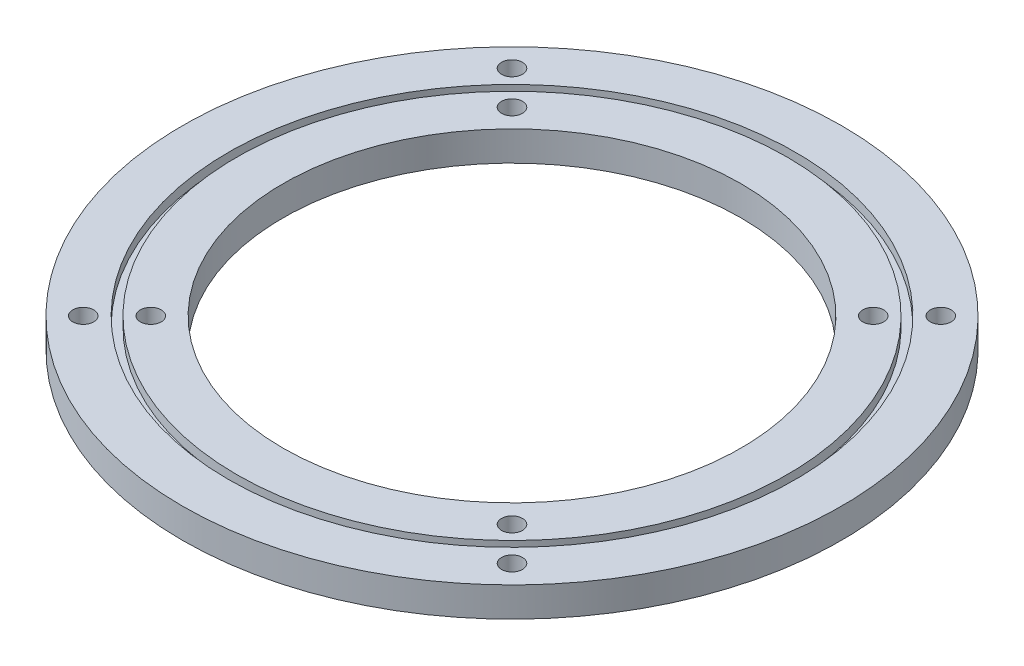
ISO-10303-21;
HEADER;
FILE_DESCRIPTION(('STEP AP214'),'2;1');
FILE_NAME('part.step','',(''),(''),'','','');
FILE_SCHEMA(('AUTOMOTIVE_DESIGN { 1 0 10303 214 1 1 1 1 }'));
ENDSEC;
DATA;
#1=APPLICATION_CONTEXT('core data for automotive mechanical design processes');
#2=APPLICATION_PROTOCOL_DEFINITION('international standard','automotive_design',2000,#1);
#3=PRODUCT_CONTEXT('',#1,'mechanical');
#4=PRODUCT('Part','Part','',(#3));
#5=PRODUCT_RELATED_PRODUCT_CATEGORY('part','',(#4));
#6=PRODUCT_DEFINITION_FORMATION('','',#4);
#7=PRODUCT_DEFINITION_CONTEXT('part definition',#1,'design');
#8=PRODUCT_DEFINITION('design','',#6,#7);
#9=PRODUCT_DEFINITION_SHAPE('','',#8);
#10=(LENGTH_UNIT() NAMED_UNIT(*) SI_UNIT(.MILLI.,.METRE.));
#11=(NAMED_UNIT(*) PLANE_ANGLE_UNIT() SI_UNIT($,.RADIAN.));
#12=(NAMED_UNIT(*) SI_UNIT($,.STERADIAN.) SOLID_ANGLE_UNIT());
#13=UNCERTAINTY_MEASURE_WITH_UNIT(LENGTH_MEASURE(1.E-05),#10,'distance_accuracy_value','');
#14=(GEOMETRIC_REPRESENTATION_CONTEXT(3) GLOBAL_UNCERTAINTY_ASSIGNED_CONTEXT((#13)) GLOBAL_UNIT_ASSIGNED_CONTEXT((#10,
#11,#12)) REPRESENTATION_CONTEXT('',''));
#15=CARTESIAN_POINT('',(0.,0.,0.));
#16=DIRECTION('',(0.,0.,1.));
#17=DIRECTION('',(1.,0.,0.));
#18=AXIS2_PLACEMENT_3D('',#15,#16,#17);
#19=CARTESIAN_POINT('',(0.,4.5,0.));
#20=DIRECTION('',(0.,-1.,0.));
#21=DIRECTION('',(0.,0.,-1.));
#22=AXIS2_PLACEMENT_3D('',#19,#20,#21);
#23=CYLINDRICAL_SURFACE('',#22,86.02);
#24=CARTESIAN_POINT('',(0.,-4.5,0.));
#25=DIRECTION('',(0.,1.,0.));
#26=DIRECTION('',(0.,0.,1.));
#27=AXIS2_PLACEMENT_3D('',#24,#25,#26);
#28=CIRCLE('',#27,86.02);
#29=CARTESIAN_POINT('',(0.,-4.5,86.02));
#30=VERTEX_POINT('',#29);
#31=EDGE_CURVE('E66',#30,#30,#28,.T.);
#32=ORIENTED_EDGE('',*,*,#31,.F.);
#33=EDGE_LOOP('',(#32));
#34=FACE_BOUND('',#33,.T.);
#35=CARTESIAN_POINT('',(0.,-1.5875,0.));
#36=DIRECTION('',(0.,1.,0.));
#37=DIRECTION('',(0.,0.,1.));
#38=AXIS2_PLACEMENT_3D('',#35,#36,#37);
#39=CIRCLE('',#38,86.02);
#40=CARTESIAN_POINT('',(0.,-1.5875,86.02));
#41=VERTEX_POINT('',#40);
#42=EDGE_CURVE('E88',#41,#41,#39,.T.);
#43=ORIENTED_EDGE('',*,*,#42,.T.);
#44=EDGE_LOOP('',(#43));
#45=FACE_BOUND('',#44,.T.);
#46=ADVANCED_FACE('F39',(#34,#45),#23,.F.);
#47=CARTESIAN_POINT('',(65.053823869162,4.5,65.0538238691627));
#48=DIRECTION('',(0.,-1.,0.));
#49=DIRECTION('',(0.,0.,-1.));
#50=AXIS2_PLACEMENT_3D('',#47,#48,#49);
#51=CYLINDRICAL_SURFACE('',#50,3.175);
#52=CARTESIAN_POINT('',(65.053823869162,4.5,65.0538238691627));
#53=DIRECTION('',(0.,1.,0.));
#54=DIRECTION('',(0.,0.,1.));
#55=AXIS2_PLACEMENT_3D('',#52,#53,#54);
#56=CIRCLE('',#55,3.175);
#57=CARTESIAN_POINT('',(65.053823869162,4.5,68.2288238691627));
#58=VERTEX_POINT('',#57);
#59=EDGE_CURVE('E50',#58,#58,#56,.F.);
#60=ORIENTED_EDGE('',*,*,#59,.F.);
#61=EDGE_LOOP('',(#60));
#62=FACE_BOUND('',#61,.T.);
#63=CARTESIAN_POINT('',(65.053823869162,-4.5,65.0538238691627));
#64=DIRECTION('',(0.,1.,0.));
#65=DIRECTION('',(0.,0.,1.));
#66=AXIS2_PLACEMENT_3D('',#63,#64,#65);
#67=CIRCLE('',#66,3.175);
#68=CARTESIAN_POINT('',(65.053823869162,-4.5,68.2288238691627));
#69=VERTEX_POINT('',#68);
#70=EDGE_CURVE('E72',#69,#69,#67,.F.);
#71=ORIENTED_EDGE('',*,*,#70,.T.);
#72=EDGE_LOOP('',(#71));
#73=FACE_BOUND('',#72,.T.);
#74=ADVANCED_FACE('F102',(#62,#73),#51,.F.);
#75=CARTESIAN_POINT('',(0.,4.5,0.));
#76=DIRECTION('',(0.,-1.,0.));
#77=DIRECTION('',(0.,0.,-1.));
#78=AXIS2_PLACEMENT_3D('',#75,#76,#77);
#79=CYLINDRICAL_SURFACE('',#78,100.);
#80=CARTESIAN_POINT('',(0.,4.5,0.));
#81=DIRECTION('',(0.,1.,0.));
#82=DIRECTION('',(0.,0.,1.));
#83=AXIS2_PLACEMENT_3D('',#80,#81,#82);
#84=CIRCLE('',#83,100.);
#85=CARTESIAN_POINT('',(0.,4.5,100.));
#86=VERTEX_POINT('',#85);
#87=EDGE_CURVE('E55',#86,#86,#84,.T.);
#88=ORIENTED_EDGE('',*,*,#87,.F.);
#89=EDGE_LOOP('',(#88));
#90=FACE_BOUND('',#89,.T.);
#91=CARTESIAN_POINT('',(0.,-4.5,0.));
#92=DIRECTION('',(0.,1.,0.));
#93=DIRECTION('',(0.,0.,1.));
#94=AXIS2_PLACEMENT_3D('',#91,#92,#93);
#95=CIRCLE('',#94,100.);
#96=CARTESIAN_POINT('',(0.,-4.5,100.));
#97=VERTEX_POINT('',#96);
#98=EDGE_CURVE('E69',#97,#97,#95,.T.);
#99=ORIENTED_EDGE('',*,*,#98,.T.);
#100=EDGE_LOOP('',(#99));
#101=FACE_BOUND('',#100,.T.);
#102=ADVANCED_FACE('F98',(#90,#101),#79,.T.);
#103=CARTESIAN_POINT('',(0.,1.5875,0.));
#104=DIRECTION('',(0.,1.,0.));
#105=DIRECTION('',(0.,0.,1.));
#106=AXIS2_PLACEMENT_3D('',#103,#104,#105);
#107=CIRCLE('',#106,86.02);
#108=CARTESIAN_POINT('',(0.,1.5875,86.02));
#109=VERTEX_POINT('',#108);
#110=EDGE_CURVE('E11',#109,#109,#107,.T.);
#111=ORIENTED_EDGE('',*,*,#110,.F.);
#112=EDGE_LOOP('',(#111));
#113=FACE_BOUND('',#112,.T.);
#114=CARTESIAN_POINT('',(0.,4.5,0.));
#115=DIRECTION('',(0.,1.,0.));
#116=DIRECTION('',(0.,0.,1.));
#117=AXIS2_PLACEMENT_3D('',#114,#115,#116);
#118=CIRCLE('',#117,86.02);
#119=CARTESIAN_POINT('',(0.,4.5,86.02));
#120=VERTEX_POINT('',#119);
#121=EDGE_CURVE('E85',#120,#120,#118,.T.);
#122=ORIENTED_EDGE('',*,*,#121,.T.);
#123=EDGE_LOOP('',(#122));
#124=FACE_BOUND('',#123,.T.);
#125=ADVANCED_FACE('F101',(#113,#124),#23,.F.);
#126=CARTESIAN_POINT('',(65.0538238691627,4.5,-65.053823869162));
#127=DIRECTION('',(0.,-1.,0.));
#128=DIRECTION('',(0.,0.,-1.));
#129=AXIS2_PLACEMENT_3D('',#126,#127,#128);
#130=CYLINDRICAL_SURFACE('',#129,3.175);
#131=CARTESIAN_POINT('',(65.0538238691627,4.5,-65.053823869162));
#132=DIRECTION('',(0.,1.,0.));
#133=DIRECTION('',(0.,0.,1.));
#134=AXIS2_PLACEMENT_3D('',#131,#132,#133);
#135=CIRCLE('',#134,3.175);
#136=CARTESIAN_POINT('',(65.0538238691627,4.5,-61.878823869162));
#137=VERTEX_POINT('',#136);
#138=EDGE_CURVE('E80',#137,#137,#135,.F.);
#139=ORIENTED_EDGE('',*,*,#138,.F.);
#140=EDGE_LOOP('',(#139));
#141=FACE_BOUND('',#140,.T.);
#142=CARTESIAN_POINT('',(65.0538238691627,-4.5,-65.053823869162));
#143=DIRECTION('',(0.,1.,0.));
#144=DIRECTION('',(0.,0.,1.));
#145=AXIS2_PLACEMENT_3D('',#142,#143,#144);
#146=CIRCLE('',#145,3.175);
#147=CARTESIAN_POINT('',(65.0538238691627,-4.5,-61.878823869162));
#148=VERTEX_POINT('',#147);
#149=EDGE_CURVE('E62',#148,#148,#146,.F.);
#150=ORIENTED_EDGE('',*,*,#149,.T.);
#151=EDGE_LOOP('',(#150));
#152=FACE_BOUND('',#151,.T.);
#153=ADVANCED_FACE('F127',(#141,#152),#130,.F.);
#154=CARTESIAN_POINT('',(-65.0538238691627,4.5,65.053823869162));
#155=DIRECTION('',(0.,-1.,0.));
#156=DIRECTION('',(0.,0.,-1.));
#157=AXIS2_PLACEMENT_3D('',#154,#155,#156);
#158=CYLINDRICAL_SURFACE('',#157,3.175);
#159=CARTESIAN_POINT('',(-65.0538238691627,4.5,65.053823869162));
#160=DIRECTION('',(0.,1.,0.));
#161=DIRECTION('',(0.,0.,1.));
#162=AXIS2_PLACEMENT_3D('',#159,#160,#161);
#163=CIRCLE('',#162,3.175);
#164=CARTESIAN_POINT('',(-65.0538238691627,4.5,68.228823869162));
#165=VERTEX_POINT('',#164);
#166=EDGE_CURVE('E76',#165,#165,#163,.F.);
#167=ORIENTED_EDGE('',*,*,#166,.F.);
#168=EDGE_LOOP('',(#167));
#169=FACE_BOUND('',#168,.T.);
#170=CARTESIAN_POINT('',(-65.0538238691627,-4.5,65.053823869162));
#171=DIRECTION('',(0.,1.,0.));
#172=DIRECTION('',(0.,0.,1.));
#173=AXIS2_PLACEMENT_3D('',#170,#171,#172);
#174=CIRCLE('',#173,3.175);
#175=CARTESIAN_POINT('',(-65.0538238691627,-4.5,68.228823869162));
#176=VERTEX_POINT('',#175);
#177=EDGE_CURVE('E59',#176,#176,#174,.F.);
#178=ORIENTED_EDGE('',*,*,#177,.T.);
#179=EDGE_LOOP('',(#178));
#180=FACE_BOUND('',#179,.T.);
#181=ADVANCED_FACE('F41',(#169,#180),#158,.F.);
#182=CARTESIAN_POINT('',(-65.053823869162,4.5,-65.0538238691627));
#183=DIRECTION('',(0.,-1.,0.));
#184=DIRECTION('',(0.,0.,-1.));
#185=AXIS2_PLACEMENT_3D('',#182,#183,#184);
#186=CYLINDRICAL_SURFACE('',#185,3.175);
#187=CARTESIAN_POINT('',(-65.053823869162,4.5,-65.0538238691627));
#188=DIRECTION('',(0.,1.,0.));
#189=DIRECTION('',(0.,0.,1.));
#190=AXIS2_PLACEMENT_3D('',#187,#188,#189);
#191=CIRCLE('',#190,3.175);
#192=CARTESIAN_POINT('',(-65.053823869162,4.5,-61.8788238691627));
#193=VERTEX_POINT('',#192);
#194=EDGE_CURVE('E46',#193,#193,#191,.F.);
#195=ORIENTED_EDGE('',*,*,#194,.F.);
#196=EDGE_LOOP('',(#195));
#197=FACE_BOUND('',#196,.T.);
#198=CARTESIAN_POINT('',(-65.053823869162,-4.5,-65.0538238691627));
#199=DIRECTION('',(0.,1.,0.));
#200=DIRECTION('',(0.,0.,1.));
#201=AXIS2_PLACEMENT_3D('',#198,#199,#200);
#202=CIRCLE('',#201,3.175);
#203=CARTESIAN_POINT('',(-65.053823869162,-4.5,-61.8788238691627));
#204=VERTEX_POINT('',#203);
#205=EDGE_CURVE('E74',#204,#204,#202,.F.);
#206=ORIENTED_EDGE('',*,*,#205,.T.);
#207=EDGE_LOOP('',(#206));
#208=FACE_BOUND('',#207,.T.);
#209=ADVANCED_FACE('F125',(#197,#208),#186,.F.);
#210=CARTESIAN_POINT('',(0.,4.5,0.));
#211=DIRECTION('',(0.,1.,0.));
#212=DIRECTION('',(0.,0.,1.));
#213=AXIS2_PLACEMENT_3D('',#210,#211,#212);
#214=PLANE('',#213);
#215=ORIENTED_EDGE('',*,*,#166,.T.);
#216=EDGE_LOOP('',(#215));
#217=FACE_BOUND('',#216,.T.);
#218=ORIENTED_EDGE('',*,*,#138,.T.);
#219=EDGE_LOOP('',(#218));
#220=FACE_BOUND('',#219,.T.);
#221=ORIENTED_EDGE('',*,*,#121,.F.);
#222=EDGE_LOOP('',(#221));
#223=FACE_BOUND('',#222,.T.);
#224=ORIENTED_EDGE('',*,*,#87,.T.);
#225=EDGE_LOOP('',(#224));
#226=FACE_BOUND('',#225,.T.);
#227=ORIENTED_EDGE('',*,*,#59,.T.);
#228=EDGE_LOOP('',(#227));
#229=FACE_BOUND('',#228,.T.);
#230=ORIENTED_EDGE('',*,*,#194,.T.);
#231=EDGE_LOOP('',(#230));
#232=FACE_BOUND('',#231,.T.);
#233=ADVANCED_FACE('F95',(#217,#220,#223,#226,#229,#232),#214,.T.);
#234=CARTESIAN_POINT('',(0.,-4.5,0.));
#235=DIRECTION('',(0.,1.,0.));
#236=DIRECTION('',(0.,0.,1.));
#237=AXIS2_PLACEMENT_3D('',#234,#235,#236);
#238=PLANE('',#237);
#239=ORIENTED_EDGE('',*,*,#177,.F.);
#240=EDGE_LOOP('',(#239));
#241=FACE_BOUND('',#240,.T.);
#242=ORIENTED_EDGE('',*,*,#149,.F.);
#243=EDGE_LOOP('',(#242));
#244=FACE_BOUND('',#243,.T.);
#245=ORIENTED_EDGE('',*,*,#31,.T.);
#246=EDGE_LOOP('',(#245));
#247=FACE_BOUND('',#246,.T.);
#248=ORIENTED_EDGE('',*,*,#98,.F.);
#249=EDGE_LOOP('',(#248));
#250=FACE_BOUND('',#249,.T.);
#251=ORIENTED_EDGE('',*,*,#70,.F.);
#252=EDGE_LOOP('',(#251));
#253=FACE_BOUND('',#252,.T.);
#254=ORIENTED_EDGE('',*,*,#205,.F.);
#255=EDGE_LOOP('',(#254));
#256=FACE_BOUND('',#255,.T.);
#257=ADVANCED_FACE('F106',(#241,#244,#247,#250,#253,#256),#238,.F.);
#258=CARTESIAN_POINT('',(0.,1.5875,0.));
#259=DIRECTION('',(0.,1.,0.));
#260=DIRECTION('',(0.,0.,1.));
#261=AXIS2_PLACEMENT_3D('',#258,#259,#260);
#262=PLANE('',#261);
#263=CARTESIAN_POINT('',(0.,1.5875,0.));
#264=DIRECTION('',(0.,1.,0.));
#265=DIRECTION('',(0.,0.,1.));
#266=AXIS2_PLACEMENT_3D('',#263,#264,#265);
#267=CIRCLE('',#266,83.48);
#268=CARTESIAN_POINT('',(0.,1.5875,83.48));
#269=VERTEX_POINT('',#268);
#270=EDGE_CURVE('E63',#269,#269,#267,.T.);
#271=ORIENTED_EDGE('',*,*,#270,.F.);
#272=EDGE_LOOP('',(#271));
#273=FACE_BOUND('',#272,.T.);
#274=ORIENTED_EDGE('',*,*,#110,.T.);
#275=EDGE_LOOP('',(#274));
#276=FACE_BOUND('',#275,.T.);
#277=ADVANCED_FACE('F109',(#273,#276),#262,.T.);
#278=CARTESIAN_POINT('',(0.,-1.5875,0.));
#279=DIRECTION('',(0.,1.,0.));
#280=DIRECTION('',(0.,0.,1.));
#281=AXIS2_PLACEMENT_3D('',#278,#279,#280);
#282=PLANE('',#281);
#283=CARTESIAN_POINT('',(0.,-1.5875,0.));
#284=DIRECTION('',(0.,1.,0.));
#285=DIRECTION('',(0.,0.,1.));
#286=AXIS2_PLACEMENT_3D('',#283,#284,#285);
#287=CIRCLE('',#286,83.48);
#288=CARTESIAN_POINT('',(0.,-1.5875,83.48));
#289=VERTEX_POINT('',#288);
#290=EDGE_CURVE('E145',#289,#289,#287,.F.);
#291=ORIENTED_EDGE('',*,*,#290,.F.);
#292=EDGE_LOOP('',(#291));
#293=FACE_BOUND('',#292,.T.);
#294=ORIENTED_EDGE('',*,*,#42,.F.);
#295=EDGE_LOOP('',(#294));
#296=FACE_BOUND('',#295,.T.);
#297=ADVANCED_FACE('F221',(#293,#296),#282,.F.);
#298=CARTESIAN_POINT('',(0.,4.5,0.));
#299=DIRECTION('',(0.,-1.,0.));
#300=DIRECTION('',(0.,0.,-1.));
#301=AXIS2_PLACEMENT_3D('',#298,#299,#300);
#302=CYLINDRICAL_SURFACE('',#301,83.48);
#303=CARTESIAN_POINT('',(0.,-4.5,0.));
#304=DIRECTION('',(0.,1.,0.));
#305=DIRECTION('',(0.,0.,1.));
#306=AXIS2_PLACEMENT_3D('',#303,#304,#305);
#307=CIRCLE('',#306,83.48);
#308=CARTESIAN_POINT('',(0.,-4.5,83.48));
#309=VERTEX_POINT('',#308);
#310=EDGE_CURVE('E156',#309,#309,#307,.T.);
#311=ORIENTED_EDGE('',*,*,#310,.T.);
#312=EDGE_LOOP('',(#311));
#313=FACE_BOUND('',#312,.T.);
#314=ORIENTED_EDGE('',*,*,#290,.T.);
#315=EDGE_LOOP('',(#314));
#316=FACE_BOUND('',#315,.T.);
#317=ADVANCED_FACE('F211',(#313,#316),#302,.T.);
#318=CARTESIAN_POINT('',(0.,4.5,0.));
#319=DIRECTION('',(0.,-1.,0.));
#320=DIRECTION('',(0.,0.,-1.));
#321=AXIS2_PLACEMENT_3D('',#318,#319,#320);
#322=CYLINDRICAL_SURFACE('',#321,69.5);
#323=CARTESIAN_POINT('',(0.,4.5,0.));
#324=DIRECTION('',(0.,1.,0.));
#325=DIRECTION('',(0.,0.,1.));
#326=AXIS2_PLACEMENT_3D('',#323,#324,#325);
#327=CIRCLE('',#326,69.5);
#328=CARTESIAN_POINT('',(0.,4.5,69.5));
#329=VERTEX_POINT('',#328);
#330=EDGE_CURVE('E153',#329,#329,#327,.T.);
#331=ORIENTED_EDGE('',*,*,#330,.T.);
#332=EDGE_LOOP('',(#331));
#333=FACE_BOUND('',#332,.T.);
#334=CARTESIAN_POINT('',(0.,-4.5,0.));
#335=DIRECTION('',(0.,1.,0.));
#336=DIRECTION('',(0.,0.,1.));
#337=AXIS2_PLACEMENT_3D('',#334,#335,#336);
#338=CIRCLE('',#337,69.5);
#339=CARTESIAN_POINT('',(0.,-4.5,69.5));
#340=VERTEX_POINT('',#339);
#341=EDGE_CURVE('E160',#340,#340,#338,.T.);
#342=ORIENTED_EDGE('',*,*,#341,.F.);
#343=EDGE_LOOP('',(#342));
#344=FACE_BOUND('',#343,.T.);
#345=ADVANCED_FACE('F220',(#333,#344),#322,.F.);
#346=CARTESIAN_POINT('',(54.8007755419577,4.5,-54.8007755419572));
#347=DIRECTION('',(0.,-1.,0.));
#348=DIRECTION('',(0.,0.,-1.));
#349=AXIS2_PLACEMENT_3D('',#346,#347,#348);
#350=CYLINDRICAL_SURFACE('',#349,3.175);
#351=CARTESIAN_POINT('',(54.8007755419577,4.5,-54.8007755419572));
#352=DIRECTION('',(0.,1.,0.));
#353=DIRECTION('',(0.,0.,1.));
#354=AXIS2_PLACEMENT_3D('',#351,#352,#353);
#355=CIRCLE('',#354,3.175);
#356=CARTESIAN_POINT('',(54.8007755419577,4.5,-51.6257755419572));
#357=VERTEX_POINT('',#356);
#358=EDGE_CURVE('E177',#357,#357,#355,.T.);
#359=ORIENTED_EDGE('',*,*,#358,.T.);
#360=EDGE_LOOP('',(#359));
#361=FACE_BOUND('',#360,.T.);
#362=CARTESIAN_POINT('',(54.8007755419577,-4.5,-54.8007755419572));
#363=DIRECTION('',(0.,1.,0.));
#364=DIRECTION('',(0.,0.,1.));
#365=AXIS2_PLACEMENT_3D('',#362,#363,#364);
#366=CIRCLE('',#365,3.175);
#367=CARTESIAN_POINT('',(54.8007755419577,-4.5,-51.6257755419572));
#368=VERTEX_POINT('',#367);
#369=EDGE_CURVE('E163',#368,#368,#366,.T.);
#370=ORIENTED_EDGE('',*,*,#369,.F.);
#371=EDGE_LOOP('',(#370));
#372=FACE_BOUND('',#371,.T.);
#373=ADVANCED_FACE('F227',(#361,#372),#350,.F.);
#374=CARTESIAN_POINT('',(54.8007755419572,4.5,54.8007755419577));
#375=DIRECTION('',(0.,-1.,0.));
#376=DIRECTION('',(0.,0.,-1.));
#377=AXIS2_PLACEMENT_3D('',#374,#375,#376);
#378=CYLINDRICAL_SURFACE('',#377,3.17499999999999);
#379=CARTESIAN_POINT('',(54.8007755419572,4.5,54.8007755419577));
#380=DIRECTION('',(0.,1.,0.));
#381=DIRECTION('',(0.,0.,1.));
#382=AXIS2_PLACEMENT_3D('',#379,#380,#381);
#383=CIRCLE('',#382,3.17499999999999);
#384=CARTESIAN_POINT('',(54.8007755419572,4.5,57.9757755419577));
#385=VERTEX_POINT('',#384);
#386=EDGE_CURVE('E180',#385,#385,#383,.T.);
#387=ORIENTED_EDGE('',*,*,#386,.T.);
#388=EDGE_LOOP('',(#387));
#389=FACE_BOUND('',#388,.T.);
#390=CARTESIAN_POINT('',(54.8007755419572,-4.5,54.8007755419577));
#391=DIRECTION('',(0.,1.,0.));
#392=DIRECTION('',(0.,0.,1.));
#393=AXIS2_PLACEMENT_3D('',#390,#391,#392);
#394=CIRCLE('',#393,3.17499999999999);
#395=CARTESIAN_POINT('',(54.8007755419572,-4.5,57.9757755419577));
#396=VERTEX_POINT('',#395);
#397=EDGE_CURVE('E166',#396,#396,#394,.T.);
#398=ORIENTED_EDGE('',*,*,#397,.F.);
#399=EDGE_LOOP('',(#398));
#400=FACE_BOUND('',#399,.T.);
#401=ADVANCED_FACE('F249',(#389,#400),#378,.F.);
#402=CARTESIAN_POINT('',(-54.8007755419577,4.5,54.8007755419572));
#403=DIRECTION('',(0.,-1.,0.));
#404=DIRECTION('',(0.,0.,-1.));
#405=AXIS2_PLACEMENT_3D('',#402,#403,#404);
#406=CYLINDRICAL_SURFACE('',#405,3.175);
#407=CARTESIAN_POINT('',(-54.8007755419577,4.5,54.8007755419572));
#408=DIRECTION('',(0.,1.,0.));
#409=DIRECTION('',(0.,0.,1.));
#410=AXIS2_PLACEMENT_3D('',#407,#408,#409);
#411=CIRCLE('',#410,3.175);
#412=CARTESIAN_POINT('',(-54.8007755419577,4.5,57.9757755419572));
#413=VERTEX_POINT('',#412);
#414=EDGE_CURVE('E183',#413,#413,#411,.T.);
#415=ORIENTED_EDGE('',*,*,#414,.T.);
#416=EDGE_LOOP('',(#415));
#417=FACE_BOUND('',#416,.T.);
#418=CARTESIAN_POINT('',(-54.8007755419577,-4.5,54.8007755419572));
#419=DIRECTION('',(0.,1.,0.));
#420=DIRECTION('',(0.,0.,1.));
#421=AXIS2_PLACEMENT_3D('',#418,#419,#420);
#422=CIRCLE('',#421,3.175);
#423=CARTESIAN_POINT('',(-54.8007755419577,-4.5,57.9757755419572));
#424=VERTEX_POINT('',#423);
#425=EDGE_CURVE('E169',#424,#424,#422,.T.);
#426=ORIENTED_EDGE('',*,*,#425,.F.);
#427=EDGE_LOOP('',(#426));
#428=FACE_BOUND('',#427,.T.);
#429=ADVANCED_FACE('F215',(#417,#428),#406,.F.);
#430=CARTESIAN_POINT('',(-54.8007755419572,4.5,-54.8007755419577));
#431=DIRECTION('',(0.,-1.,0.));
#432=DIRECTION('',(0.,0.,-1.));
#433=AXIS2_PLACEMENT_3D('',#430,#431,#432);
#434=CYLINDRICAL_SURFACE('',#433,3.175);
#435=CARTESIAN_POINT('',(-54.8007755419572,4.5,-54.8007755419577));
#436=DIRECTION('',(0.,1.,0.));
#437=DIRECTION('',(0.,0.,1.));
#438=AXIS2_PLACEMENT_3D('',#435,#436,#437);
#439=CIRCLE('',#438,3.175);
#440=CARTESIAN_POINT('',(-54.8007755419572,4.5,-51.6257755419577));
#441=VERTEX_POINT('',#440);
#442=EDGE_CURVE('E159',#441,#441,#439,.T.);
#443=ORIENTED_EDGE('',*,*,#442,.T.);
#444=EDGE_LOOP('',(#443));
#445=FACE_BOUND('',#444,.T.);
#446=CARTESIAN_POINT('',(-54.8007755419572,-4.5,-54.8007755419577));
#447=DIRECTION('',(0.,1.,0.));
#448=DIRECTION('',(0.,0.,1.));
#449=AXIS2_PLACEMENT_3D('',#446,#447,#448);
#450=CIRCLE('',#449,3.175);
#451=CARTESIAN_POINT('',(-54.8007755419572,-4.5,-51.6257755419577));
#452=VERTEX_POINT('',#451);
#453=EDGE_CURVE('E172',#452,#452,#450,.T.);
#454=ORIENTED_EDGE('',*,*,#453,.F.);
#455=EDGE_LOOP('',(#454));
#456=FACE_BOUND('',#455,.T.);
#457=ADVANCED_FACE('F189',(#445,#456),#434,.F.);
#458=ORIENTED_EDGE('',*,*,#270,.T.);
#459=EDGE_LOOP('',(#458));
#460=FACE_BOUND('',#459,.T.);
#461=CARTESIAN_POINT('',(0.,4.5,0.));
#462=DIRECTION('',(0.,1.,0.));
#463=DIRECTION('',(0.,0.,1.));
#464=AXIS2_PLACEMENT_3D('',#461,#462,#463);
#465=CIRCLE('',#464,83.48);
#466=CARTESIAN_POINT('',(0.,4.5,83.48));
#467=VERTEX_POINT('',#466);
#468=EDGE_CURVE('E148',#467,#467,#465,.T.);
#469=ORIENTED_EDGE('',*,*,#468,.F.);
#470=EDGE_LOOP('',(#469));
#471=FACE_BOUND('',#470,.T.);
#472=ADVANCED_FACE('F196',(#460,#471),#302,.T.);
#473=CARTESIAN_POINT('',(0.,4.5,0.));
#474=DIRECTION('',(0.,1.,0.));
#475=DIRECTION('',(0.,0.,1.));
#476=AXIS2_PLACEMENT_3D('',#473,#474,#475);
#477=PLANE('',#476);
#478=ORIENTED_EDGE('',*,*,#442,.F.);
#479=EDGE_LOOP('',(#478));
#480=FACE_BOUND('',#479,.T.);
#481=ORIENTED_EDGE('',*,*,#414,.F.);
#482=EDGE_LOOP('',(#481));
#483=FACE_BOUND('',#482,.T.);
#484=ORIENTED_EDGE('',*,*,#386,.F.);
#485=EDGE_LOOP('',(#484));
#486=FACE_BOUND('',#485,.T.);
#487=ORIENTED_EDGE('',*,*,#358,.F.);
#488=EDGE_LOOP('',(#487));
#489=FACE_BOUND('',#488,.T.);
#490=ORIENTED_EDGE('',*,*,#330,.F.);
#491=EDGE_LOOP('',(#490));
#492=FACE_BOUND('',#491,.T.);
#493=ORIENTED_EDGE('',*,*,#468,.T.);
#494=EDGE_LOOP('',(#493));
#495=FACE_BOUND('',#494,.T.);
#496=ADVANCED_FACE('F192',(#480,#483,#486,#489,#492,#495),#477,.T.);
#497=CARTESIAN_POINT('',(0.,-4.5,0.));
#498=DIRECTION('',(0.,1.,0.));
#499=DIRECTION('',(0.,0.,1.));
#500=AXIS2_PLACEMENT_3D('',#497,#498,#499);
#501=PLANE('',#500);
#502=ORIENTED_EDGE('',*,*,#453,.T.);
#503=EDGE_LOOP('',(#502));
#504=FACE_BOUND('',#503,.T.);
#505=ORIENTED_EDGE('',*,*,#425,.T.);
#506=EDGE_LOOP('',(#505));
#507=FACE_BOUND('',#506,.T.);
#508=ORIENTED_EDGE('',*,*,#397,.T.);
#509=EDGE_LOOP('',(#508));
#510=FACE_BOUND('',#509,.T.);
#511=ORIENTED_EDGE('',*,*,#369,.T.);
#512=EDGE_LOOP('',(#511));
#513=FACE_BOUND('',#512,.T.);
#514=ORIENTED_EDGE('',*,*,#341,.T.);
#515=EDGE_LOOP('',(#514));
#516=FACE_BOUND('',#515,.T.);
#517=ORIENTED_EDGE('',*,*,#310,.F.);
#518=EDGE_LOOP('',(#517));
#519=FACE_BOUND('',#518,.T.);
#520=ADVANCED_FACE('F195',(#504,#507,#510,#513,#516,#519),#501,.F.);
#521=CLOSED_SHELL('',(#46,#74,#102,#125,#153,#181,#209,#233,#257,#277,#297,#317,#345,#373,#401,
#429,#457,#472,#496,#520));
#522=MANIFOLD_SOLID_BREP('B2',#521);
#523=ADVANCED_BREP_SHAPE_REPRESENTATION('',(#18,#522),#14);
#524=SHAPE_DEFINITION_REPRESENTATION(#9,#523);
ENDSEC;
END-ISO-10303-21;
